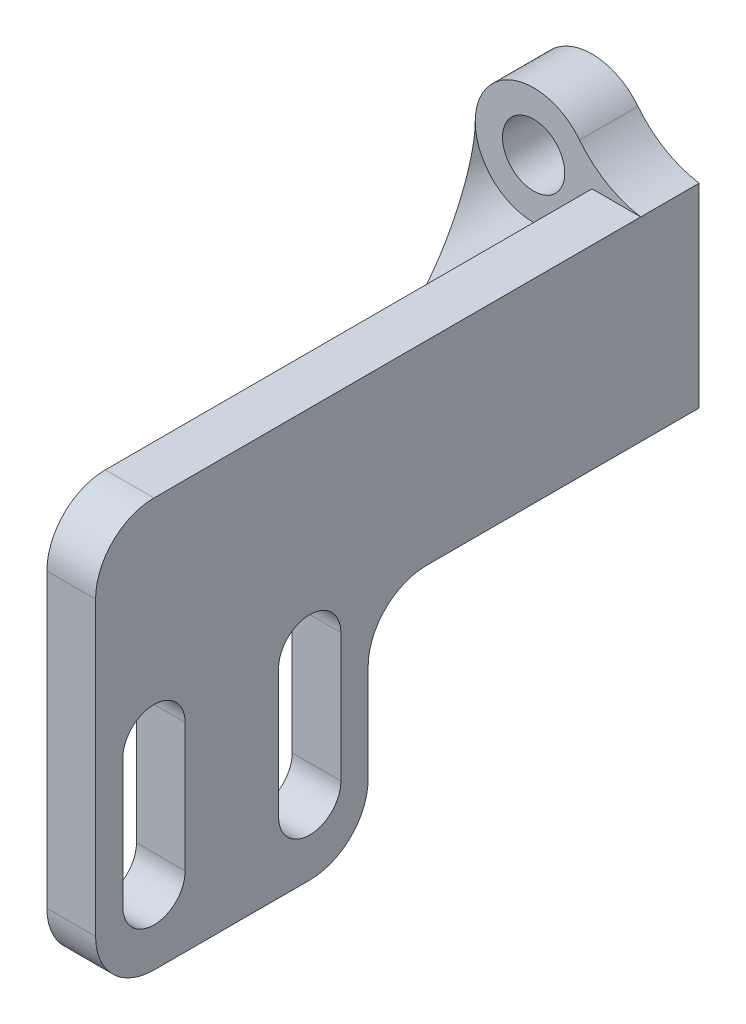
ISO-10303-21;
HEADER;
FILE_DESCRIPTION(('STEP AP214'),'2;1');
FILE_NAME('part.step','',(''),(''),'','','');
FILE_SCHEMA(('AUTOMOTIVE_DESIGN { 1 0 10303 214 1 1 1 1 }'));
ENDSEC;
DATA;
#1=APPLICATION_CONTEXT('core data for automotive mechanical design processes');
#2=APPLICATION_PROTOCOL_DEFINITION('international standard','automotive_design',2000,#1);
#3=PRODUCT_CONTEXT('',#1,'mechanical');
#4=PRODUCT('Part','Part','',(#3));
#5=PRODUCT_RELATED_PRODUCT_CATEGORY('part','',(#4));
#6=PRODUCT_DEFINITION_FORMATION('','',#4);
#7=PRODUCT_DEFINITION_CONTEXT('part definition',#1,'design');
#8=PRODUCT_DEFINITION('design','',#6,#7);
#9=PRODUCT_DEFINITION_SHAPE('','',#8);
#10=(LENGTH_UNIT() NAMED_UNIT(*) SI_UNIT(.MILLI.,.METRE.));
#11=(NAMED_UNIT(*) PLANE_ANGLE_UNIT() SI_UNIT($,.RADIAN.));
#12=(NAMED_UNIT(*) SI_UNIT($,.STERADIAN.) SOLID_ANGLE_UNIT());
#13=UNCERTAINTY_MEASURE_WITH_UNIT(LENGTH_MEASURE(1.E-05),#10,'distance_accuracy_value','');
#14=(GEOMETRIC_REPRESENTATION_CONTEXT(3) GLOBAL_UNCERTAINTY_ASSIGNED_CONTEXT((#13)) GLOBAL_UNIT_ASSIGNED_CONTEXT((#10,
#11,#12)) REPRESENTATION_CONTEXT('',''));
#15=CARTESIAN_POINT('',(0.,0.,0.));
#16=DIRECTION('',(0.,0.,1.));
#17=DIRECTION('',(1.,0.,0.));
#18=AXIS2_PLACEMENT_3D('',#15,#16,#17);
#19=CARTESIAN_POINT('',(3.00000000000005,-33.0103407456897,3.));
#20=DIRECTION('',(0.,1.,0.));
#21=DIRECTION('',(0.,0.,1.));
#22=AXIS2_PLACEMENT_3D('',#19,#20,#21);
#23=PLANE('',#22);
#24=DIRECTION('',(0.,0.,-1.));
#25=VECTOR('',#24,1.);
#26=CARTESIAN_POINT('',(3.00000000000005,-33.0103407456897,31.));
#27=LINE('',#26,#25);
#28=CARTESIAN_POINT('',(3.00000000000005,-33.0103407456897,28.));
#29=VERTEX_POINT('',#28);
#30=CARTESIAN_POINT('',(3.00000000000004,-33.0103407456897,14.));
#31=VERTEX_POINT('',#30);
#32=EDGE_CURVE('E368',#29,#31,#27,.T.);
#33=ORIENTED_EDGE('',*,*,#32,.F.);
#34=DIRECTION('',(-1.,0.,0.));
#35=VECTOR('',#34,1.);
#36=CARTESIAN_POINT('',(3.00000000000005,-33.0103407456897,28.));
#37=LINE('',#36,#35);
#38=CARTESIAN_POINT('',(5.50000000000005,-33.0103407456897,28.));
#39=VERTEX_POINT('',#38);
#40=EDGE_CURVE('E316',#29,#39,#37,.F.);
#41=ORIENTED_EDGE('',*,*,#40,.T.);
#42=DIRECTION('',(0.,0.,-1.));
#43=VECTOR('',#42,1.);
#44=CARTESIAN_POINT('',(5.50000000000005,-33.0103407456897,3.));
#45=LINE('',#44,#43);
#46=CARTESIAN_POINT('',(5.50000000000005,-33.0103407456897,3.));
#47=VERTEX_POINT('',#46);
#48=EDGE_CURVE('E260',#39,#47,#45,.T.);
#49=ORIENTED_EDGE('',*,*,#48,.T.);
#50=DIRECTION('',(-1.,0.,0.));
#51=VECTOR('',#50,1.);
#52=CARTESIAN_POINT('',(0.,-33.0103407456897,3.));
#53=LINE('',#52,#51);
#54=CARTESIAN_POINT('',(3.00000000000004,-33.0103407456897,3.));
#55=VERTEX_POINT('',#54);
#56=EDGE_CURVE('E253',#47,#55,#53,.T.);
#57=ORIENTED_EDGE('',*,*,#56,.T.);
#58=DIRECTION('',(0.,0.,-1.));
#59=VECTOR('',#58,1.);
#60=CARTESIAN_POINT('',(3.00000000000004,-33.0103407456897,31.));
#61=LINE('',#60,#59);
#62=EDGE_CURVE('E236',#55,#31,#61,.F.);
#63=ORIENTED_EDGE('',*,*,#62,.T.);
#64=EDGE_LOOP('',(#33,#41,#49,#57,#63));
#65=FACE_BOUND('',#64,.T.);
#66=ADVANCED_FACE('F67',(#65),#23,.T.);
#67=CARTESIAN_POINT('',(5.50000000000005,-43.0103407456897,3.));
#68=DIRECTION('',(0.,-1.,0.));
#69=DIRECTION('',(0.,0.,-1.));
#70=AXIS2_PLACEMENT_3D('',#67,#68,#69);
#71=PLANE('',#70);
#72=DIRECTION('',(0.,0.,-1.));
#73=VECTOR('',#72,1.);
#74=CARTESIAN_POINT('',(5.50000000000005,-43.0103407456897,3.));
#75=LINE('',#74,#73);
#76=CARTESIAN_POINT('',(5.50000000000005,-43.0103407456897,14.));
#77=VERTEX_POINT('',#76);
#78=CARTESIAN_POINT('',(5.50000000000005,-43.0103407456897,3.));
#79=VERTEX_POINT('',#78);
#80=EDGE_CURVE('E323',#77,#79,#75,.T.);
#81=ORIENTED_EDGE('',*,*,#80,.F.);
#82=DIRECTION('',(1.,0.,0.));
#83=VECTOR('',#82,1.);
#84=CARTESIAN_POINT('',(3.00000000000005,-43.0103407456897,14.));
#85=LINE('',#84,#83);
#86=CARTESIAN_POINT('',(3.00000000000005,-43.0103407456897,14.));
#87=VERTEX_POINT('',#86);
#88=EDGE_CURVE('E293',#77,#87,#85,.F.);
#89=ORIENTED_EDGE('',*,*,#88,.T.);
#90=DIRECTION('',(0.,0.,-1.));
#91=VECTOR('',#90,1.);
#92=CARTESIAN_POINT('',(3.00000000000005,-43.0103407456897,31.));
#93=LINE('',#92,#91);
#94=CARTESIAN_POINT('',(3.00000000000005,-43.0103407456897,3.));
#95=VERTEX_POINT('',#94);
#96=EDGE_CURVE('E245',#87,#95,#93,.T.);
#97=ORIENTED_EDGE('',*,*,#96,.T.);
#98=DIRECTION('',(1.,0.,0.));
#99=VECTOR('',#98,1.);
#100=CARTESIAN_POINT('',(0.,-43.0103407456897,3.));
#101=LINE('',#100,#99);
#102=EDGE_CURVE('E335',#95,#79,#101,.T.);
#103=ORIENTED_EDGE('',*,*,#102,.T.);
#104=EDGE_LOOP('',(#81,#89,#97,#103));
#105=FACE_BOUND('',#104,.T.);
#106=ADVANCED_FACE('F331',(#105),#71,.T.);
#107=CARTESIAN_POINT('',(3.00000000000005,-20.480376659548,14.));
#108=DIRECTION('',(-0.877895572914384,0.,0.478852130680573));
#109=DIRECTION('',(0.478852130680573,0.,0.877895572914384));
#110=AXIS2_PLACEMENT_3D('',#107,#108,#109);
#111=PLANE('',#110);
#112=DIRECTION('',(0.,-1.,0.));
#113=VECTOR('',#112,1.);
#114=CARTESIAN_POINT('',(-2.99999999999995,0.,3.));
#115=LINE('',#114,#113);
#116=CARTESIAN_POINT('',(-2.99999999999995,-33.0103407456897,3.));
#117=VERTEX_POINT('',#116);
#118=CARTESIAN_POINT('',(-2.99999999999995,-43.0103407456897,3.));
#119=VERTEX_POINT('',#118);
#120=EDGE_CURVE('E371',#117,#119,#115,.T.);
#121=ORIENTED_EDGE('',*,*,#120,.T.);
#122=CARTESIAN_POINT('',(0.,-43.0103407456897,8.5));
#123=DIRECTION('',(-0.877895572914384,0.,0.478852130680573));
#124=DIRECTION('',(-0.478852130680573,0.,-0.877895572914384));
#125=AXIS2_PLACEMENT_3D('',#122,#123,#124);
#126=ELLIPSE('',#125,6.26498204307084,3.);
#127=EDGE_CURVE('E290',#119,#87,#126,.F.);
#128=ORIENTED_EDGE('',*,*,#127,.T.);
#129=DIRECTION('',(0.,-1.,0.));
#130=VECTOR('',#129,1.);
#131=CARTESIAN_POINT('',(3.00000000000005,-20.480376659548,14.));
#132=LINE('',#131,#130);
#133=EDGE_CURVE('E348',#31,#87,#132,.T.);
#134=ORIENTED_EDGE('',*,*,#133,.F.);
#135=CARTESIAN_POINT('',(0.,-33.0103407456897,8.5));
#136=DIRECTION('',(-0.877895572914384,0.,0.478852130680573));
#137=DIRECTION('',(-0.478852130680573,0.,-0.877895572914384));
#138=AXIS2_PLACEMENT_3D('',#135,#136,#137);
#139=ELLIPSE('',#138,6.26498204307082,2.99999999999999);
#140=EDGE_CURVE('E241',#31,#117,#139,.F.);
#141=ORIENTED_EDGE('',*,*,#140,.T.);
#142=EDGE_LOOP('',(#121,#128,#134,#141));
#143=FACE_BOUND('',#142,.T.);
#144=ADVANCED_FACE('F440',(#143),#111,.T.);
#145=CARTESIAN_POINT('',(0.,0.,3.));
#146=DIRECTION('',(0.,0.,1.));
#147=DIRECTION('',(1.,0.,0.));
#148=AXIS2_PLACEMENT_3D('',#145,#146,#147);
#149=PLANE('',#148);
#150=CARTESIAN_POINT('',(0.,-43.0103407456897,3.));
#151=DIRECTION('',(0.,0.,1.));
#152=DIRECTION('',(1.,0.,0.));
#153=AXIS2_PLACEMENT_3D('',#150,#151,#152);
#154=CIRCLE('',#153,3.);
#155=CARTESIAN_POINT('',(2.3607954545455,-44.8614606288408,3.));
#156=VERTEX_POINT('',#155);
#157=EDGE_CURVE('E374',#119,#156,#154,.T.);
#158=ORIENTED_EDGE('',*,*,#157,.T.);
#159=CARTESIAN_POINT('',(6.29545454545459,-47.9466604340928,3.));
#160=DIRECTION('',(0.,0.,1.));
#161=DIRECTION('',(1.,0.,0.));
#162=AXIS2_PLACEMENT_3D('',#159,#160,#161);
#163=CIRCLE('',#162,5.);
#164=EDGE_CURVE('E267',#156,#79,#163,.F.);
#165=ORIENTED_EDGE('',*,*,#164,.T.);
#166=ORIENTED_EDGE('',*,*,#102,.F.);
#167=CARTESIAN_POINT('',(0.,-43.0103407456897,3.));
#168=DIRECTION('',(0.,0.,1.));
#169=DIRECTION('',(1.,0.,0.));
#170=AXIS2_PLACEMENT_3D('',#167,#168,#169);
#171=CIRCLE('',#170,3.);
#172=EDGE_CURVE('E246',#95,#119,#171,.T.);
#173=ORIENTED_EDGE('',*,*,#172,.T.);
#174=EDGE_LOOP('',(#158,#165,#166,#173));
#175=FACE_BOUND('',#174,.T.);
#176=CARTESIAN_POINT('',(0.,-43.0103407456897,3.));
#177=DIRECTION('',(0.,0.,1.));
#178=DIRECTION('',(1.,0.,0.));
#179=AXIS2_PLACEMENT_3D('',#176,#177,#178);
#180=CIRCLE('',#179,1.6);
#181=CARTESIAN_POINT('',(1.60000000000005,-43.0103407456897,3.));
#182=VERTEX_POINT('',#181);
#183=EDGE_CURVE('E382',#182,#182,#180,.T.);
#184=ORIENTED_EDGE('',*,*,#183,.F.);
#185=EDGE_LOOP('',(#184));
#186=FACE_BOUND('',#185,.T.);
#187=ADVANCED_FACE('F414',(#175,#186),#149,.T.);
#188=CARTESIAN_POINT('',(0.,-43.0103407456897,3.));
#189=DIRECTION('',(0.,0.,-1.));
#190=DIRECTION('',(-1.,0.,0.));
#191=AXIS2_PLACEMENT_3D('',#188,#189,#190);
#192=CYLINDRICAL_SURFACE('',#191,1.6);
#193=ORIENTED_EDGE('',*,*,#183,.T.);
#194=EDGE_LOOP('',(#193));
#195=FACE_BOUND('',#194,.T.);
#196=CARTESIAN_POINT('',(0.,-43.0103407456897,0.));
#197=DIRECTION('',(0.,0.,1.));
#198=DIRECTION('',(1.,0.,0.));
#199=AXIS2_PLACEMENT_3D('',#196,#197,#198);
#200=CIRCLE('',#199,1.6);
#201=CARTESIAN_POINT('',(1.60000000000005,-43.0103407456897,0.));
#202=VERTEX_POINT('',#201);
#203=EDGE_CURVE('E375',#202,#202,#200,.T.);
#204=ORIENTED_EDGE('',*,*,#203,.F.);
#205=EDGE_LOOP('',(#204));
#206=FACE_BOUND('',#205,.T.);
#207=ADVANCED_FACE('F451',(#195,#206),#192,.F.);
#208=CARTESIAN_POINT('',(0.,-33.0103407456897,3.));
#209=DIRECTION('',(0.,0.,-1.));
#210=DIRECTION('',(-1.,0.,0.));
#211=AXIS2_PLACEMENT_3D('',#208,#209,#210);
#212=CYLINDRICAL_SURFACE('',#211,1.6);
#213=CARTESIAN_POINT('',(0.,-33.0103407456897,3.));
#214=DIRECTION('',(0.,0.,1.));
#215=DIRECTION('',(1.,0.,0.));
#216=AXIS2_PLACEMENT_3D('',#213,#214,#215);
#217=CIRCLE('',#216,1.6);
#218=CARTESIAN_POINT('',(1.60000000000005,-33.0103407456897,3.));
#219=VERTEX_POINT('',#218);
#220=EDGE_CURVE('E379',#219,#219,#217,.T.);
#221=ORIENTED_EDGE('',*,*,#220,.T.);
#222=EDGE_LOOP('',(#221));
#223=FACE_BOUND('',#222,.T.);
#224=CARTESIAN_POINT('',(0.,-33.0103407456897,0.));
#225=DIRECTION('',(0.,0.,1.));
#226=DIRECTION('',(1.,0.,0.));
#227=AXIS2_PLACEMENT_3D('',#224,#225,#226);
#228=CIRCLE('',#227,1.6);
#229=CARTESIAN_POINT('',(1.60000000000005,-33.0103407456897,0.));
#230=VERTEX_POINT('',#229);
#231=EDGE_CURVE('E394',#230,#230,#228,.T.);
#232=ORIENTED_EDGE('',*,*,#231,.F.);
#233=EDGE_LOOP('',(#232));
#234=FACE_BOUND('',#233,.T.);
#235=ADVANCED_FACE('F444',(#223,#234),#212,.F.);
#236=CARTESIAN_POINT('',(0.,-43.0103407456897,3.));
#237=DIRECTION('',(0.,0.,-1.));
#238=DIRECTION('',(-1.,0.,0.));
#239=AXIS2_PLACEMENT_3D('',#236,#237,#238);
#240=CYLINDRICAL_SURFACE('',#239,3.);
#241=CARTESIAN_POINT('',(0.,-43.0103407456897,0.));
#242=DIRECTION('',(0.,0.,1.));
#243=DIRECTION('',(1.,0.,0.));
#244=AXIS2_PLACEMENT_3D('',#241,#242,#243);
#245=CIRCLE('',#244,3.);
#246=CARTESIAN_POINT('',(-2.99999999999995,-43.0103407456897,0.));
#247=VERTEX_POINT('',#246);
#248=CARTESIAN_POINT('',(2.3607954545455,-44.8614606288408,0.));
#249=VERTEX_POINT('',#248);
#250=EDGE_CURVE('E389',#247,#249,#245,.T.);
#251=ORIENTED_EDGE('',*,*,#250,.T.);
#252=DIRECTION('',(0.,0.,-1.));
#253=VECTOR('',#252,1.);
#254=CARTESIAN_POINT('',(2.3607954545455,-44.8614606288408,3.));
#255=LINE('',#254,#253);
#256=EDGE_CURVE('E408',#249,#156,#255,.F.);
#257=ORIENTED_EDGE('',*,*,#256,.T.);
#258=ORIENTED_EDGE('',*,*,#157,.F.);
#259=DIRECTION('',(0.,0.,-1.));
#260=VECTOR('',#259,1.);
#261=CARTESIAN_POINT('',(-2.99999999999995,-43.0103407456897,3.));
#262=LINE('',#261,#260);
#263=EDGE_CURVE('E401',#119,#247,#262,.T.);
#264=ORIENTED_EDGE('',*,*,#263,.T.);
#265=EDGE_LOOP('',(#251,#257,#258,#264));
#266=FACE_BOUND('',#265,.T.);
#267=ADVANCED_FACE('F442',(#266),#240,.T.);
#268=CARTESIAN_POINT('',(0.,-33.0103407456897,3.));
#269=DIRECTION('',(0.,0.,-1.));
#270=DIRECTION('',(-1.,0.,0.));
#271=AXIS2_PLACEMENT_3D('',#268,#269,#270);
#272=CYLINDRICAL_SURFACE('',#271,3.);
#273=CARTESIAN_POINT('',(0.,-33.0103407456897,3.));
#274=DIRECTION('',(0.,0.,1.));
#275=DIRECTION('',(1.,0.,0.));
#276=AXIS2_PLACEMENT_3D('',#273,#274,#275);
#277=CIRCLE('',#276,3.);
#278=CARTESIAN_POINT('',(2.3607954545455,-31.1592208625386,3.));
#279=VERTEX_POINT('',#278);
#280=EDGE_CURVE('E256',#279,#117,#277,.T.);
#281=ORIENTED_EDGE('',*,*,#280,.F.);
#282=DIRECTION('',(0.,0.,-1.));
#283=VECTOR('',#282,1.);
#284=CARTESIAN_POINT('',(2.3607954545455,-31.1592208625386,3.));
#285=LINE('',#284,#283);
#286=CARTESIAN_POINT('',(2.3607954545455,-31.1592208625386,0.));
#287=VERTEX_POINT('',#286);
#288=EDGE_CURVE('E262',#279,#287,#285,.T.);
#289=ORIENTED_EDGE('',*,*,#288,.T.);
#290=CARTESIAN_POINT('',(0.,-33.0103407456897,0.));
#291=DIRECTION('',(0.,0.,1.));
#292=DIRECTION('',(1.,0.,0.));
#293=AXIS2_PLACEMENT_3D('',#290,#291,#292);
#294=CIRCLE('',#293,3.);
#295=CARTESIAN_POINT('',(-2.99999999999995,-33.0103407456897,0.));
#296=VERTEX_POINT('',#295);
#297=EDGE_CURVE('E392',#287,#296,#294,.T.);
#298=ORIENTED_EDGE('',*,*,#297,.T.);
#299=DIRECTION('',(0.,0.,-1.));
#300=VECTOR('',#299,1.);
#301=CARTESIAN_POINT('',(-2.99999999999995,-33.0103407456897,3.));
#302=LINE('',#301,#300);
#303=EDGE_CURVE('E385',#117,#296,#302,.T.);
#304=ORIENTED_EDGE('',*,*,#303,.F.);
#305=EDGE_LOOP('',(#281,#289,#298,#304));
#306=FACE_BOUND('',#305,.T.);
#307=ADVANCED_FACE('F433',(#306),#272,.T.);
#308=CARTESIAN_POINT('',(-2.99999999999995,0.,3.));
#309=DIRECTION('',(1.,0.,0.));
#310=DIRECTION('',(0.,0.,-1.));
#311=AXIS2_PLACEMENT_3D('',#308,#309,#310);
#312=PLANE('',#311);
#313=DIRECTION('',(0.,-1.,0.));
#314=VECTOR('',#313,1.);
#315=CARTESIAN_POINT('',(-2.99999999999995,0.,0.));
#316=LINE('',#315,#314);
#317=EDGE_CURVE('E386',#296,#247,#316,.T.);
#318=ORIENTED_EDGE('',*,*,#317,.T.);
#319=ORIENTED_EDGE('',*,*,#263,.F.);
#320=ORIENTED_EDGE('',*,*,#120,.F.);
#321=ORIENTED_EDGE('',*,*,#303,.T.);
#322=EDGE_LOOP('',(#318,#319,#320,#321));
#323=FACE_BOUND('',#322,.T.);
#324=ADVANCED_FACE('F437',(#323),#312,.F.);
#325=CARTESIAN_POINT('',(0.,0.,0.));
#326=DIRECTION('',(0.,0.,1.));
#327=DIRECTION('',(1.,0.,0.));
#328=AXIS2_PLACEMENT_3D('',#325,#326,#327);
#329=PLANE('',#328);
#330=ORIENTED_EDGE('',*,*,#317,.F.);
#331=ORIENTED_EDGE('',*,*,#297,.F.);
#332=CARTESIAN_POINT('',(6.29545454545459,-28.0740210572866,0.));
#333=DIRECTION('',(0.,0.,1.));
#334=DIRECTION('',(1.,0.,0.));
#335=AXIS2_PLACEMENT_3D('',#332,#333,#334);
#336=CIRCLE('',#335,5.);
#337=CARTESIAN_POINT('',(5.50000000000005,-33.0103407456897,0.));
#338=VERTEX_POINT('',#337);
#339=EDGE_CURVE('E261',#287,#338,#336,.T.);
#340=ORIENTED_EDGE('',*,*,#339,.T.);
#341=DIRECTION('',(0.,-1.,0.));
#342=VECTOR('',#341,1.);
#343=CARTESIAN_POINT('',(5.50000000000005,-33.0103407456897,0.));
#344=LINE('',#343,#342);
#345=CARTESIAN_POINT('',(5.50000000000005,-43.0103407456897,0.));
#346=VERTEX_POINT('',#345);
#347=EDGE_CURVE('E370',#338,#346,#344,.T.);
#348=ORIENTED_EDGE('',*,*,#347,.T.);
#349=CARTESIAN_POINT('',(6.29545454545459,-47.9466604340928,0.));
#350=DIRECTION('',(0.,0.,1.));
#351=DIRECTION('',(1.,0.,0.));
#352=AXIS2_PLACEMENT_3D('',#349,#350,#351);
#353=CIRCLE('',#352,5.);
#354=EDGE_CURVE('E410',#346,#249,#353,.T.);
#355=ORIENTED_EDGE('',*,*,#354,.T.);
#356=ORIENTED_EDGE('',*,*,#250,.F.);
#357=EDGE_LOOP('',(#330,#331,#340,#348,#355,#356));
#358=FACE_BOUND('',#357,.T.);
#359=ORIENTED_EDGE('',*,*,#231,.T.);
#360=EDGE_LOOP('',(#359));
#361=FACE_BOUND('',#360,.T.);
#362=ORIENTED_EDGE('',*,*,#203,.T.);
#363=EDGE_LOOP('',(#362));
#364=FACE_BOUND('',#363,.T.);
#365=ADVANCED_FACE('F425',(#358,#361,#364),#329,.F.);
#366=CARTESIAN_POINT('',(6.29545454545459,-28.0740210572866,3.));
#367=DIRECTION('',(0.,0.,1.));
#368=DIRECTION('',(1.,0.,0.));
#369=AXIS2_PLACEMENT_3D('',#366,#367,#368);
#370=CIRCLE('',#369,5.);
#371=EDGE_CURVE('E264',#47,#279,#370,.F.);
#372=ORIENTED_EDGE('',*,*,#371,.T.);
#373=ORIENTED_EDGE('',*,*,#280,.T.);
#374=CARTESIAN_POINT('',(0.,-33.0103407456897,3.));
#375=DIRECTION('',(0.,0.,1.));
#376=DIRECTION('',(1.,0.,0.));
#377=AXIS2_PLACEMENT_3D('',#374,#375,#376);
#378=CIRCLE('',#377,2.99999999999999);
#379=EDGE_CURVE('E239',#117,#55,#378,.T.);
#380=ORIENTED_EDGE('',*,*,#379,.T.);
#381=ORIENTED_EDGE('',*,*,#56,.F.);
#382=EDGE_LOOP('',(#372,#373,#380,#381));
#383=FACE_BOUND('',#382,.T.);
#384=ORIENTED_EDGE('',*,*,#220,.F.);
#385=EDGE_LOOP('',(#384));
#386=FACE_BOUND('',#385,.T.);
#387=ADVANCED_FACE('F251',(#383,#386),#149,.T.);
#388=CARTESIAN_POINT('',(5.50000000000005,-33.0103407456897,3.));
#389=DIRECTION('',(1.,0.,0.));
#390=DIRECTION('',(0.,0.,-1.));
#391=AXIS2_PLACEMENT_3D('',#388,#389,#390);
#392=PLANE('',#391);
#393=CARTESIAN_POINT('',(5.50000000000005,-50.4027629683853,28.));
#394=DIRECTION('',(1.,0.,0.));
#395=DIRECTION('',(0.,0.,1.));
#396=AXIS2_PLACEMENT_3D('',#393,#394,#395);
#397=CIRCLE('',#396,1.6);
#398=CARTESIAN_POINT('',(5.50000000000005,-50.4027629683853,29.6));
#399=VERTEX_POINT('',#398);
#400=CARTESIAN_POINT('',(5.50000000000005,-50.4027629683853,26.4));
#401=VERTEX_POINT('',#400);
#402=EDGE_CURVE('E582',#399,#401,#397,.T.);
#403=ORIENTED_EDGE('',*,*,#402,.F.);
#404=DIRECTION('',(0.,-1.,0.));
#405=VECTOR('',#404,1.);
#406=CARTESIAN_POINT('',(5.50000000000005,-50.4027629683853,29.6));
#407=LINE('',#406,#405);
#408=CARTESIAN_POINT('',(5.50000000000005,-43.7974390871688,29.6));
#409=VERTEX_POINT('',#408);
#410=EDGE_CURVE('E598',#409,#399,#407,.T.);
#411=ORIENTED_EDGE('',*,*,#410,.F.);
#412=CARTESIAN_POINT('',(5.50000000000005,-43.7974390871688,28.));
#413=DIRECTION('',(1.,0.,0.));
#414=DIRECTION('',(0.,0.,1.));
#415=AXIS2_PLACEMENT_3D('',#412,#413,#414);
#416=CIRCLE('',#415,1.59999999999999);
#417=CARTESIAN_POINT('',(5.50000000000005,-43.7974390871688,26.4));
#418=VERTEX_POINT('',#417);
#419=EDGE_CURVE('E591',#418,#409,#416,.T.);
#420=ORIENTED_EDGE('',*,*,#419,.F.);
#421=DIRECTION('',(0.,1.,0.));
#422=VECTOR('',#421,1.);
#423=CARTESIAN_POINT('',(5.50000000000005,-50.4027629683853,26.4));
#424=LINE('',#423,#422);
#425=EDGE_CURVE('E584',#401,#418,#424,.T.);
#426=ORIENTED_EDGE('',*,*,#425,.F.);
#427=EDGE_LOOP('',(#403,#411,#420,#426));
#428=FACE_BOUND('',#427,.T.);
#429=CARTESIAN_POINT('',(5.50000000000005,-50.4027629683853,20.));
#430=DIRECTION('',(1.,0.,0.));
#431=DIRECTION('',(0.,0.,-1.));
#432=AXIS2_PLACEMENT_3D('',#429,#430,#431);
#433=CIRCLE('',#432,1.6);
#434=CARTESIAN_POINT('',(5.50000000000005,-50.4027629683853,21.6));
#435=VERTEX_POINT('',#434);
#436=CARTESIAN_POINT('',(5.50000000000005,-50.4027629683853,18.4));
#437=VERTEX_POINT('',#436);
#438=EDGE_CURVE('E360',#435,#437,#433,.T.);
#439=ORIENTED_EDGE('',*,*,#438,.F.);
#440=DIRECTION('',(0.,-1.,0.));
#441=VECTOR('',#440,1.);
#442=CARTESIAN_POINT('',(5.50000000000005,-50.4027629683853,21.6));
#443=LINE('',#442,#441);
#444=CARTESIAN_POINT('',(5.50000000000005,-43.7974390871688,21.6));
#445=VERTEX_POINT('',#444);
#446=EDGE_CURVE('E563',#445,#435,#443,.T.);
#447=ORIENTED_EDGE('',*,*,#446,.F.);
#448=CARTESIAN_POINT('',(5.50000000000005,-43.7974390871688,20.));
#449=DIRECTION('',(1.,0.,0.));
#450=DIRECTION('',(0.,0.,-1.));
#451=AXIS2_PLACEMENT_3D('',#448,#449,#450);
#452=CIRCLE('',#451,1.59999999999999);
#453=CARTESIAN_POINT('',(5.50000000000005,-43.7974390871688,18.4));
#454=VERTEX_POINT('',#453);
#455=EDGE_CURVE('E570',#454,#445,#452,.T.);
#456=ORIENTED_EDGE('',*,*,#455,.F.);
#457=DIRECTION('',(0.,1.,0.));
#458=VECTOR('',#457,1.);
#459=CARTESIAN_POINT('',(5.50000000000005,-50.4027629683853,18.4));
#460=LINE('',#459,#458);
#461=EDGE_CURVE('E574',#437,#454,#460,.T.);
#462=ORIENTED_EDGE('',*,*,#461,.F.);
#463=EDGE_LOOP('',(#439,#447,#456,#462));
#464=FACE_BOUND('',#463,.T.);
#465=DIRECTION('',(0.,0.,-1.));
#466=VECTOR('',#465,1.);
#467=CARTESIAN_POINT('',(5.50000000000005,-54.0103407456897,31.));
#468=LINE('',#467,#466);
#469=CARTESIAN_POINT('',(5.50000000000005,-54.0103407456897,28.));
#470=VERTEX_POINT('',#469);
#471=CARTESIAN_POINT('',(5.50000000000005,-54.0103407456897,20.));
#472=VERTEX_POINT('',#471);
#473=EDGE_CURVE('E356',#470,#472,#468,.T.);
#474=ORIENTED_EDGE('',*,*,#473,.T.);
#475=CARTESIAN_POINT('',(5.50000000000005,-51.0103407456897,20.));
#476=DIRECTION('',(1.,0.,0.));
#477=DIRECTION('',(0.,0.,-1.));
#478=AXIS2_PLACEMENT_3D('',#475,#476,#477);
#479=CIRCLE('',#478,3.);
#480=CARTESIAN_POINT('',(5.50000000000005,-51.0103407456897,17.));
#481=VERTEX_POINT('',#480);
#482=EDGE_CURVE('E304',#472,#481,#479,.T.);
#483=ORIENTED_EDGE('',*,*,#482,.T.);
#484=DIRECTION('',(0.,1.,0.));
#485=VECTOR('',#484,1.);
#486=CARTESIAN_POINT('',(5.50000000000005,-54.0103407456897,17.));
#487=LINE('',#486,#485);
#488=CARTESIAN_POINT('',(5.50000000000005,-46.0103407456897,17.));
#489=VERTEX_POINT('',#488);
#490=EDGE_CURVE('E326',#481,#489,#487,.T.);
#491=ORIENTED_EDGE('',*,*,#490,.T.);
#492=CARTESIAN_POINT('',(5.50000000000005,-46.0103407456897,14.));
#493=DIRECTION('',(1.,0.,0.));
#494=DIRECTION('',(0.,0.,-1.));
#495=AXIS2_PLACEMENT_3D('',#492,#493,#494);
#496=CIRCLE('',#495,3.);
#497=EDGE_CURVE('E75',#489,#77,#496,.F.);
#498=ORIENTED_EDGE('',*,*,#497,.T.);
#499=ORIENTED_EDGE('',*,*,#80,.T.);
#500=EDGE_CURVE('E338',#79,#346,#75,.T.);
#501=ORIENTED_EDGE('',*,*,#500,.T.);
#502=ORIENTED_EDGE('',*,*,#347,.F.);
#503=EDGE_CURVE('E337',#47,#338,#45,.T.);
#504=ORIENTED_EDGE('',*,*,#503,.F.);
#505=ORIENTED_EDGE('',*,*,#48,.F.);
#506=CARTESIAN_POINT('',(5.50000000000005,-36.0103407456897,28.));
#507=DIRECTION('',(1.,0.,0.));
#508=DIRECTION('',(0.,0.,-1.));
#509=AXIS2_PLACEMENT_3D('',#506,#507,#508);
#510=CIRCLE('',#509,3.);
#511=CARTESIAN_POINT('',(5.50000000000005,-36.0103407456897,31.));
#512=VERTEX_POINT('',#511);
#513=EDGE_CURVE('E300',#39,#512,#510,.T.);
#514=ORIENTED_EDGE('',*,*,#513,.T.);
#515=DIRECTION('',(0.,1.,0.));
#516=VECTOR('',#515,1.);
#517=CARTESIAN_POINT('',(5.50000000000005,-43.0103407456897,31.));
#518=LINE('',#517,#516);
#519=CARTESIAN_POINT('',(5.50000000000005,-51.0103407456897,31.));
#520=VERTEX_POINT('',#519);
#521=EDGE_CURVE('E365',#520,#512,#518,.T.);
#522=ORIENTED_EDGE('',*,*,#521,.F.);
#523=CARTESIAN_POINT('',(5.50000000000005,-51.0103407456897,28.));
#524=DIRECTION('',(1.,0.,0.));
#525=DIRECTION('',(0.,0.,-1.));
#526=AXIS2_PLACEMENT_3D('',#523,#524,#525);
#527=CIRCLE('',#526,3.);
#528=EDGE_CURVE('E302',#520,#470,#527,.T.);
#529=ORIENTED_EDGE('',*,*,#528,.T.);
#530=EDGE_LOOP('',(#474,#483,#491,#498,#499,#501,#502,#504,#505,#514,#522,#529));
#531=FACE_BOUND('',#530,.T.);
#532=ADVANCED_FACE('F321',(#428,#464,#531),#392,.T.);
#533=CARTESIAN_POINT('',(3.00000000000005,-33.0103407456897,31.));
#534=DIRECTION('',(1.,0.,0.));
#535=DIRECTION('',(0.,0.,-1.));
#536=AXIS2_PLACEMENT_3D('',#533,#534,#535);
#537=PLANE('',#536);
#538=CARTESIAN_POINT('',(3.00000000000005,-43.7974390871688,20.));
#539=DIRECTION('',(1.,0.,0.));
#540=DIRECTION('',(0.,0.,-1.));
#541=AXIS2_PLACEMENT_3D('',#538,#539,#540);
#542=CIRCLE('',#541,1.59999999999999);
#543=CARTESIAN_POINT('',(3.00000000000005,-43.7974390871688,18.4));
#544=VERTEX_POINT('',#543);
#545=CARTESIAN_POINT('',(3.00000000000005,-43.0103407456897,18.6069902366312));
#546=VERTEX_POINT('',#545);
#547=EDGE_CURVE('E282',#544,#546,#542,.T.);
#548=ORIENTED_EDGE('',*,*,#547,.T.);
#549=CARTESIAN_POINT('',(3.00000000000005,-43.0103407456897,18.6069902366312));
#550=CARTESIAN_POINT('',(3.00000000000005,-42.8255462385766,18.7114054775635));
#551=CARTESIAN_POINT('',(3.00000000000005,-42.6739752234487,18.8607770424912));
#552=CARTESIAN_POINT('',(3.00000000000005,-42.5229886259483,19.009572670288));
#553=CARTESIAN_POINT('',(3.00000000000005,-42.4155278479124,19.1935749713602));
#554=CARTESIAN_POINT('',(3.00000000000005,-42.3086218136222,19.3766273991149));
#555=CARTESIAN_POINT('',(3.00000000000005,-42.2529233082254,19.5823027309225));
#556=CARTESIAN_POINT('',(3.00000000000005,-42.1975123346907,19.7869163069301));
#557=CARTESIAN_POINT('',(3.00000000000005,-42.1974390871688,20.));
#558=CARTESIAN_POINT('',(3.00000000000005,-42.1973662177719,20.2119836931563));
#559=CARTESIAN_POINT('',(3.00000000000005,-42.2529233082254,20.4176972690776));
#560=CARTESIAN_POINT('',(3.00000000000005,-42.3081935968411,20.6223488917693));
#561=CARTESIAN_POINT('',(3.00000000000005,-42.4155278479124,20.8064250286398));
#562=CARTESIAN_POINT('',(3.00000000000005,-42.5223080084066,20.9895509110307));
#563=CARTESIAN_POINT('',(3.00000000000005,-42.6739752234487,21.1392229575088));
#564=CARTESIAN_POINT('',(3.00000000000005,-42.8250589415279,21.288319182874));
#565=CARTESIAN_POINT('',(3.00000000000005,-43.0103407456897,21.3930097633688));
#566=B_SPLINE_CURVE_WITH_KNOTS('',2,(#549,#550,#551,#552,#553,#554,#555,#556,#557,#558,#559,
#560,#561,#562,#563,#564,#565),.UNSPECIFIED.,.F.,.F.,(3,2,2,2,2,2,2,2,3),(0.,0.125,0.25,0.375,
0.5,0.625,0.75,0.875,1.),.UNSPECIFIED.);
#567=CARTESIAN_POINT('',(3.00000000000005,-43.0103407456897,21.3930097633688));
#568=VERTEX_POINT('',#567);
#569=EDGE_CURVE('E286',#546,#568,#566,.T.);
#570=ORIENTED_EDGE('',*,*,#569,.T.);
#571=CARTESIAN_POINT('',(3.00000000000005,-43.7974390871688,21.6));
#572=VERTEX_POINT('',#571);
#573=EDGE_CURVE('E275',#568,#572,#542,.T.);
#574=ORIENTED_EDGE('',*,*,#573,.T.);
#575=DIRECTION('',(0.,-1.,0.));
#576=VECTOR('',#575,1.);
#577=CARTESIAN_POINT('',(3.00000000000005,-33.0103407456897,21.6));
#578=LINE('',#577,#576);
#579=CARTESIAN_POINT('',(3.00000000000005,-50.4027629683853,21.6));
#580=VERTEX_POINT('',#579);
#581=EDGE_CURVE('E278',#572,#580,#578,.T.);
#582=ORIENTED_EDGE('',*,*,#581,.T.);
#583=CARTESIAN_POINT('',(3.00000000000005,-50.4027629683853,20.));
#584=DIRECTION('',(1.,0.,0.));
#585=DIRECTION('',(0.,0.,-1.));
#586=AXIS2_PLACEMENT_3D('',#583,#584,#585);
#587=CIRCLE('',#586,1.6);
#588=CARTESIAN_POINT('',(3.00000000000005,-50.4027629683853,18.4));
#589=VERTEX_POINT('',#588);
#590=EDGE_CURVE('E630',#580,#589,#587,.T.);
#591=ORIENTED_EDGE('',*,*,#590,.T.);
#592=DIRECTION('',(0.,1.,0.));
#593=VECTOR('',#592,1.);
#594=CARTESIAN_POINT('',(3.00000000000005,-33.0103407456897,18.4));
#595=LINE('',#594,#593);
#596=EDGE_CURVE('E272',#589,#544,#595,.T.);
#597=ORIENTED_EDGE('',*,*,#596,.T.);
#598=EDGE_LOOP('',(#548,#570,#574,#582,#591,#597));
#599=FACE_BOUND('',#598,.T.);
#600=CARTESIAN_POINT('',(3.00000000000005,-43.7974390871688,28.));
#601=DIRECTION('',(1.,0.,0.));
#602=DIRECTION('',(0.,0.,-1.));
#603=AXIS2_PLACEMENT_3D('',#600,#601,#602);
#604=CIRCLE('',#603,1.59999999999999);
#605=CARTESIAN_POINT('',(3.00000000000005,-43.7974390871688,26.4));
#606=VERTEX_POINT('',#605);
#607=CARTESIAN_POINT('',(3.00000000000005,-43.0103407456897,26.6069902366312));
#608=VERTEX_POINT('',#607);
#609=EDGE_CURVE('E621',#606,#608,#604,.T.);
#610=ORIENTED_EDGE('',*,*,#609,.T.);
#611=CARTESIAN_POINT('',(3.00000000000005,-43.0103407456897,26.6069902366312));
#612=CARTESIAN_POINT('',(3.00000000000005,-42.8255462385766,26.7114054775635));
#613=CARTESIAN_POINT('',(3.00000000000005,-42.6739752234487,26.8607770424912));
#614=CARTESIAN_POINT('',(3.00000000000005,-42.5229886259493,27.009572670287));
#615=CARTESIAN_POINT('',(3.00000000000005,-42.4155278479124,27.1935749713602));
#616=CARTESIAN_POINT('',(3.00000000000005,-42.3086218136226,27.3766273991136));
#617=CARTESIAN_POINT('',(3.00000000000005,-42.2529233082254,27.5823027309224));
#618=CARTESIAN_POINT('',(3.00000000000005,-42.1975123346907,27.7869163069301));
#619=CARTESIAN_POINT('',(3.00000000000005,-42.1974390871688,28.));
#620=CARTESIAN_POINT('',(3.00000000000005,-42.1973662177719,28.2119836931569));
#621=CARTESIAN_POINT('',(3.00000000000005,-42.2529233082254,28.4176972690775));
#622=CARTESIAN_POINT('',(3.00000000000005,-42.3081935968415,28.6223488917699));
#623=CARTESIAN_POINT('',(3.00000000000005,-42.4155278479124,28.8064250286398));
#624=CARTESIAN_POINT('',(3.00000000000005,-42.5223080084056,28.9895509110291));
#625=CARTESIAN_POINT('',(3.00000000000005,-42.6739752234487,29.1392229575088));
#626=CARTESIAN_POINT('',(3.00000000000005,-42.8250589415263,29.2883191828731));
#627=CARTESIAN_POINT('',(3.00000000000005,-43.0103407456897,29.3930097633688));
#628=B_SPLINE_CURVE_WITH_KNOTS('',2,(#611,#612,#613,#614,#615,#616,#617,#618,#619,#620,#621,
#622,#623,#624,#625,#626,#627),.UNSPECIFIED.,.F.,.F.,(3,2,2,2,2,2,2,2,3),(0.,0.125,0.25,0.375,
0.5,0.625,0.75,0.875,1.),.UNSPECIFIED.);
#629=CARTESIAN_POINT('',(3.00000000000005,-43.0103407456897,29.3930097633688));
#630=VERTEX_POINT('',#629);
#631=EDGE_CURVE('E623',#608,#630,#628,.T.);
#632=ORIENTED_EDGE('',*,*,#631,.T.);
#633=CARTESIAN_POINT('',(3.00000000000005,-43.7974390871688,29.6));
#634=VERTEX_POINT('',#633);
#635=EDGE_CURVE('E629',#630,#634,#604,.T.);
#636=ORIENTED_EDGE('',*,*,#635,.T.);
#637=DIRECTION('',(0.,-1.,0.));
#638=VECTOR('',#637,1.);
#639=CARTESIAN_POINT('',(3.00000000000005,-33.0103407456897,29.6));
#640=LINE('',#639,#638);
#641=CARTESIAN_POINT('',(3.00000000000005,-50.4027629683853,29.6));
#642=VERTEX_POINT('',#641);
#643=EDGE_CURVE('E625',#634,#642,#640,.T.);
#644=ORIENTED_EDGE('',*,*,#643,.T.);
#645=CARTESIAN_POINT('',(3.00000000000005,-50.4027629683853,28.));
#646=DIRECTION('',(1.,0.,0.));
#647=DIRECTION('',(0.,0.,-1.));
#648=AXIS2_PLACEMENT_3D('',#645,#646,#647);
#649=CIRCLE('',#648,1.6);
#650=CARTESIAN_POINT('',(3.00000000000005,-50.4027629683853,26.4));
#651=VERTEX_POINT('',#650);
#652=EDGE_CURVE('E628',#642,#651,#649,.T.);
#653=ORIENTED_EDGE('',*,*,#652,.T.);
#654=DIRECTION('',(0.,1.,0.));
#655=VECTOR('',#654,1.);
#656=CARTESIAN_POINT('',(3.00000000000005,-33.0103407456897,26.4));
#657=LINE('',#656,#655);
#658=EDGE_CURVE('E613',#651,#606,#657,.T.);
#659=ORIENTED_EDGE('',*,*,#658,.T.);
#660=EDGE_LOOP('',(#610,#632,#636,#644,#653,#659));
#661=FACE_BOUND('',#660,.T.);
#662=DIRECTION('',(0.,-1.,0.));
#663=VECTOR('',#662,1.);
#664=CARTESIAN_POINT('',(3.00000000000005,-54.0103407456897,17.));
#665=LINE('',#664,#663);
#666=CARTESIAN_POINT('',(3.00000000000005,-46.0103407456897,17.));
#667=VERTEX_POINT('',#666);
#668=CARTESIAN_POINT('',(3.00000000000005,-51.0103407456897,17.));
#669=VERTEX_POINT('',#668);
#670=EDGE_CURVE('E346',#667,#669,#665,.T.);
#671=ORIENTED_EDGE('',*,*,#670,.T.);
#672=CARTESIAN_POINT('',(3.00000000000005,-51.0103407456897,20.));
#673=DIRECTION('',(1.,0.,0.));
#674=DIRECTION('',(0.,0.,-1.));
#675=AXIS2_PLACEMENT_3D('',#672,#673,#674);
#676=CIRCLE('',#675,3.);
#677=CARTESIAN_POINT('',(3.00000000000005,-54.0103407456897,20.));
#678=VERTEX_POINT('',#677);
#679=EDGE_CURVE('E308',#669,#678,#676,.F.);
#680=ORIENTED_EDGE('',*,*,#679,.T.);
#681=DIRECTION('',(0.,0.,1.));
#682=VECTOR('',#681,1.);
#683=CARTESIAN_POINT('',(3.00000000000005,-54.0103407456897,31.));
#684=LINE('',#683,#682);
#685=CARTESIAN_POINT('',(3.00000000000005,-54.0103407456897,28.));
#686=VERTEX_POINT('',#685);
#687=EDGE_CURVE('E352',#678,#686,#684,.T.);
#688=ORIENTED_EDGE('',*,*,#687,.T.);
#689=CARTESIAN_POINT('',(3.00000000000005,-51.0103407456897,28.));
#690=DIRECTION('',(1.,0.,0.));
#691=DIRECTION('',(0.,0.,-1.));
#692=AXIS2_PLACEMENT_3D('',#689,#690,#691);
#693=CIRCLE('',#692,3.);
#694=CARTESIAN_POINT('',(3.00000000000005,-51.0103407456897,31.));
#695=VERTEX_POINT('',#694);
#696=EDGE_CURVE('E88',#686,#695,#693,.F.);
#697=ORIENTED_EDGE('',*,*,#696,.T.);
#698=DIRECTION('',(0.,-1.,0.));
#699=VECTOR('',#698,1.);
#700=CARTESIAN_POINT('',(3.00000000000005,-33.0103407456897,31.));
#701=LINE('',#700,#699);
#702=CARTESIAN_POINT('',(3.00000000000005,-36.0103407456897,31.));
#703=VERTEX_POINT('',#702);
#704=EDGE_CURVE('E354',#703,#695,#701,.T.);
#705=ORIENTED_EDGE('',*,*,#704,.F.);
#706=CARTESIAN_POINT('',(3.00000000000005,-36.0103407456897,28.));
#707=DIRECTION('',(1.,0.,0.));
#708=DIRECTION('',(0.,0.,-1.));
#709=AXIS2_PLACEMENT_3D('',#706,#707,#708);
#710=CIRCLE('',#709,3.);
#711=EDGE_CURVE('E82',#703,#29,#710,.F.);
#712=ORIENTED_EDGE('',*,*,#711,.T.);
#713=ORIENTED_EDGE('',*,*,#32,.T.);
#714=ORIENTED_EDGE('',*,*,#133,.T.);
#715=CARTESIAN_POINT('',(3.00000000000005,-46.0103407456897,14.));
#716=DIRECTION('',(1.,0.,0.));
#717=DIRECTION('',(0.,0.,-1.));
#718=AXIS2_PLACEMENT_3D('',#715,#716,#717);
#719=CIRCLE('',#718,3.);
#720=EDGE_CURVE('E12',#87,#667,#719,.T.);
#721=ORIENTED_EDGE('',*,*,#720,.T.);
#722=EDGE_LOOP('',(#671,#680,#688,#697,#705,#712,#713,#714,#721));
#723=FACE_BOUND('',#722,.T.);
#724=ADVANCED_FACE('F345',(#599,#661,#723),#537,.F.);
#725=CARTESIAN_POINT('',(0.,0.,31.));
#726=DIRECTION('',(0.,0.,1.));
#727=DIRECTION('',(1.,0.,0.));
#728=AXIS2_PLACEMENT_3D('',#725,#726,#727);
#729=PLANE('',#728);
#730=ORIENTED_EDGE('',*,*,#704,.T.);
#731=DIRECTION('',(1.,0.,0.));
#732=VECTOR('',#731,1.);
#733=CARTESIAN_POINT('',(0.,-51.0103407456897,31.));
#734=LINE('',#733,#732);
#735=EDGE_CURVE('E313',#695,#520,#734,.T.);
#736=ORIENTED_EDGE('',*,*,#735,.T.);
#737=ORIENTED_EDGE('',*,*,#521,.T.);
#738=DIRECTION('',(-1.,0.,0.));
#739=VECTOR('',#738,1.);
#740=CARTESIAN_POINT('',(0.,-36.0103407456897,31.));
#741=LINE('',#740,#739);
#742=EDGE_CURVE('E310',#512,#703,#741,.T.);
#743=ORIENTED_EDGE('',*,*,#742,.T.);
#744=EDGE_LOOP('',(#730,#736,#737,#743));
#745=FACE_BOUND('',#744,.T.);
#746=ADVANCED_FACE('F468',(#745),#729,.T.);
#747=CARTESIAN_POINT('',(6.29545454545459,-47.9466604340928,3.));
#748=DIRECTION('',(0.,0.,1.));
#749=DIRECTION('',(1.,0.,0.));
#750=AXIS2_PLACEMENT_3D('',#747,#748,#749);
#751=CYLINDRICAL_SURFACE('',#750,5.);
#752=ORIENTED_EDGE('',*,*,#164,.F.);
#753=ORIENTED_EDGE('',*,*,#256,.F.);
#754=ORIENTED_EDGE('',*,*,#354,.F.);
#755=ORIENTED_EDGE('',*,*,#500,.F.);
#756=EDGE_LOOP('',(#752,#753,#754,#755));
#757=FACE_BOUND('',#756,.T.);
#758=ADVANCED_FACE('F420',(#757),#751,.F.);
#759=CARTESIAN_POINT('',(6.29545454545459,-28.0740210572866,3.));
#760=DIRECTION('',(0.,0.,1.));
#761=DIRECTION('',(1.,0.,0.));
#762=AXIS2_PLACEMENT_3D('',#759,#760,#761);
#763=CYLINDRICAL_SURFACE('',#762,5.);
#764=ORIENTED_EDGE('',*,*,#371,.F.);
#765=ORIENTED_EDGE('',*,*,#503,.T.);
#766=ORIENTED_EDGE('',*,*,#339,.F.);
#767=ORIENTED_EDGE('',*,*,#288,.F.);
#768=EDGE_LOOP('',(#764,#765,#766,#767));
#769=FACE_BOUND('',#768,.T.);
#770=ADVANCED_FACE('F431',(#769),#763,.F.);
#771=CARTESIAN_POINT('',(-14.8044938147648,-54.0103407456897,17.));
#772=DIRECTION('',(0.,0.,-1.));
#773=DIRECTION('',(-1.,0.,0.));
#774=AXIS2_PLACEMENT_3D('',#771,#772,#773);
#775=PLANE('',#774);
#776=ORIENTED_EDGE('',*,*,#670,.F.);
#777=DIRECTION('',(1.,0.,0.));
#778=VECTOR('',#777,1.);
#779=CARTESIAN_POINT('',(5.50000000000005,-46.0103407456897,17.));
#780=LINE('',#779,#778);
#781=EDGE_CURVE('E289',#667,#489,#780,.T.);
#782=ORIENTED_EDGE('',*,*,#781,.T.);
#783=ORIENTED_EDGE('',*,*,#490,.F.);
#784=DIRECTION('',(1.,0.,0.));
#785=VECTOR('',#784,1.);
#786=CARTESIAN_POINT('',(-14.8044938147648,-51.0103407456897,17.));
#787=LINE('',#786,#785);
#788=EDGE_CURVE('E287',#481,#669,#787,.F.);
#789=ORIENTED_EDGE('',*,*,#788,.T.);
#790=EDGE_LOOP('',(#776,#782,#783,#789));
#791=FACE_BOUND('',#790,.T.);
#792=ADVANCED_FACE('F350',(#791),#775,.T.);
#793=CARTESIAN_POINT('',(-14.8044938147648,-54.0103407456897,31.));
#794=DIRECTION('',(0.,-1.,0.));
#795=DIRECTION('',(0.,0.,-1.));
#796=AXIS2_PLACEMENT_3D('',#793,#794,#795);
#797=PLANE('',#796);
#798=ORIENTED_EDGE('',*,*,#687,.F.);
#799=DIRECTION('',(1.,0.,0.));
#800=VECTOR('',#799,1.);
#801=CARTESIAN_POINT('',(-14.8044938147648,-54.0103407456897,20.));
#802=LINE('',#801,#800);
#803=EDGE_CURVE('E297',#678,#472,#802,.T.);
#804=ORIENTED_EDGE('',*,*,#803,.T.);
#805=ORIENTED_EDGE('',*,*,#473,.F.);
#806=DIRECTION('',(1.,0.,0.));
#807=VECTOR('',#806,1.);
#808=CARTESIAN_POINT('',(-14.8044938147648,-54.0103407456897,28.));
#809=LINE('',#808,#807);
#810=EDGE_CURVE('E295',#470,#686,#809,.F.);
#811=ORIENTED_EDGE('',*,*,#810,.T.);
#812=EDGE_LOOP('',(#798,#804,#805,#811));
#813=FACE_BOUND('',#812,.T.);
#814=ADVANCED_FACE('F494',(#813),#797,.T.);
#815=CARTESIAN_POINT('',(-2.99999999999995,-50.4027629683853,20.));
#816=DIRECTION('',(1.,0.,0.));
#817=DIRECTION('',(0.,0.,-1.));
#818=AXIS2_PLACEMENT_3D('',#815,#816,#817);
#819=CYLINDRICAL_SURFACE('',#818,1.6);
#820=DIRECTION('',(1.,0.,0.));
#821=VECTOR('',#820,1.);
#822=CARTESIAN_POINT('',(-2.99999999999995,-50.4027629683853,21.6));
#823=LINE('',#822,#821);
#824=EDGE_CURVE('E567',#580,#435,#823,.T.);
#825=ORIENTED_EDGE('',*,*,#824,.T.);
#826=ORIENTED_EDGE('',*,*,#438,.T.);
#827=DIRECTION('',(1.,0.,0.));
#828=VECTOR('',#827,1.);
#829=CARTESIAN_POINT('',(-2.99999999999995,-50.4027629683853,18.4));
#830=LINE('',#829,#828);
#831=EDGE_CURVE('E576',#589,#437,#830,.T.);
#832=ORIENTED_EDGE('',*,*,#831,.F.);
#833=ORIENTED_EDGE('',*,*,#590,.F.);
#834=EDGE_LOOP('',(#825,#826,#832,#833));
#835=FACE_BOUND('',#834,.T.);
#836=ADVANCED_FACE('F497',(#835),#819,.F.);
#837=CARTESIAN_POINT('',(-2.99999999999995,-50.4027629683853,21.6));
#838=DIRECTION('',(0.,0.,1.));
#839=DIRECTION('',(0.,-1.,0.));
#840=AXIS2_PLACEMENT_3D('',#837,#838,#839);
#841=PLANE('',#840);
#842=DIRECTION('',(1.,0.,0.));
#843=VECTOR('',#842,1.);
#844=CARTESIAN_POINT('',(-2.99999999999995,-43.7974390871688,21.6));
#845=LINE('',#844,#843);
#846=EDGE_CURVE('E559',#572,#445,#845,.T.);
#847=ORIENTED_EDGE('',*,*,#846,.T.);
#848=ORIENTED_EDGE('',*,*,#446,.T.);
#849=ORIENTED_EDGE('',*,*,#824,.F.);
#850=ORIENTED_EDGE('',*,*,#581,.F.);
#851=EDGE_LOOP('',(#847,#848,#849,#850));
#852=FACE_BOUND('',#851,.T.);
#853=ADVANCED_FACE('F504',(#852),#841,.F.);
#854=CARTESIAN_POINT('',(-2.99999999999995,-43.7974390871688,20.));
#855=DIRECTION('',(1.,0.,0.));
#856=DIRECTION('',(0.,0.,-1.));
#857=AXIS2_PLACEMENT_3D('',#854,#855,#856);
#858=CYLINDRICAL_SURFACE('',#857,1.59999999999999);
#859=DIRECTION('',(1.,0.,0.));
#860=VECTOR('',#859,1.);
#861=CARTESIAN_POINT('',(-2.99999999999995,-43.7974390871688,18.4));
#862=LINE('',#861,#860);
#863=EDGE_CURVE('E566',#544,#454,#862,.T.);
#864=ORIENTED_EDGE('',*,*,#863,.T.);
#865=ORIENTED_EDGE('',*,*,#455,.T.);
#866=ORIENTED_EDGE('',*,*,#846,.F.);
#867=ORIENTED_EDGE('',*,*,#573,.F.);
#868=ORIENTED_EDGE('',*,*,#569,.F.);
#869=ORIENTED_EDGE('',*,*,#547,.F.);
#870=EDGE_LOOP('',(#864,#865,#866,#867,#868,#869));
#871=FACE_BOUND('',#870,.T.);
#872=ADVANCED_FACE('F541',(#871),#858,.F.);
#873=CARTESIAN_POINT('',(-2.99999999999995,-50.4027629683853,18.4));
#874=DIRECTION('',(0.,0.,-1.));
#875=DIRECTION('',(0.,1.,0.));
#876=AXIS2_PLACEMENT_3D('',#873,#874,#875);
#877=PLANE('',#876);
#878=ORIENTED_EDGE('',*,*,#831,.T.);
#879=ORIENTED_EDGE('',*,*,#461,.T.);
#880=ORIENTED_EDGE('',*,*,#863,.F.);
#881=ORIENTED_EDGE('',*,*,#596,.F.);
#882=EDGE_LOOP('',(#878,#879,#880,#881));
#883=FACE_BOUND('',#882,.T.);
#884=ADVANCED_FACE('F550',(#883),#877,.F.);
#885=CARTESIAN_POINT('',(-2.99999999999995,-50.4027629683853,28.));
#886=DIRECTION('',(1.,0.,0.));
#887=DIRECTION('',(0.,0.,-1.));
#888=AXIS2_PLACEMENT_3D('',#885,#886,#887);
#889=CYLINDRICAL_SURFACE('',#888,1.6);
#890=DIRECTION('',(1.,0.,0.));
#891=VECTOR('',#890,1.);
#892=CARTESIAN_POINT('',(-2.99999999999995,-50.4027629683853,29.6));
#893=LINE('',#892,#891);
#894=EDGE_CURVE('E362',#642,#399,#893,.T.);
#895=ORIENTED_EDGE('',*,*,#894,.T.);
#896=ORIENTED_EDGE('',*,*,#402,.T.);
#897=DIRECTION('',(1.,0.,0.));
#898=VECTOR('',#897,1.);
#899=CARTESIAN_POINT('',(-2.99999999999995,-50.4027629683853,26.4));
#900=LINE('',#899,#898);
#901=EDGE_CURVE('E601',#651,#401,#900,.T.);
#902=ORIENTED_EDGE('',*,*,#901,.F.);
#903=ORIENTED_EDGE('',*,*,#652,.F.);
#904=EDGE_LOOP('',(#895,#896,#902,#903));
#905=FACE_BOUND('',#904,.T.);
#906=ADVANCED_FACE('F655',(#905),#889,.F.);
#907=CARTESIAN_POINT('',(-2.99999999999995,-50.4027629683853,29.6));
#908=DIRECTION('',(0.,0.,1.));
#909=DIRECTION('',(0.,-1.,0.));
#910=AXIS2_PLACEMENT_3D('',#907,#908,#909);
#911=PLANE('',#910);
#912=DIRECTION('',(1.,0.,0.));
#913=VECTOR('',#912,1.);
#914=CARTESIAN_POINT('',(-2.99999999999995,-43.7974390871688,29.6));
#915=LINE('',#914,#913);
#916=EDGE_CURVE('E603',#634,#409,#915,.T.);
#917=ORIENTED_EDGE('',*,*,#916,.T.);
#918=ORIENTED_EDGE('',*,*,#410,.T.);
#919=ORIENTED_EDGE('',*,*,#894,.F.);
#920=ORIENTED_EDGE('',*,*,#643,.F.);
#921=EDGE_LOOP('',(#917,#918,#919,#920));
#922=FACE_BOUND('',#921,.T.);
#923=ADVANCED_FACE('F651',(#922),#911,.F.);
#924=CARTESIAN_POINT('',(-2.99999999999995,-43.7974390871688,28.));
#925=DIRECTION('',(1.,0.,0.));
#926=DIRECTION('',(0.,0.,-1.));
#927=AXIS2_PLACEMENT_3D('',#924,#925,#926);
#928=CYLINDRICAL_SURFACE('',#927,1.59999999999999);
#929=DIRECTION('',(1.,0.,0.));
#930=VECTOR('',#929,1.);
#931=CARTESIAN_POINT('',(-2.99999999999995,-43.7974390871688,26.4));
#932=LINE('',#931,#930);
#933=EDGE_CURVE('E605',#606,#418,#932,.T.);
#934=ORIENTED_EDGE('',*,*,#933,.T.);
#935=ORIENTED_EDGE('',*,*,#419,.T.);
#936=ORIENTED_EDGE('',*,*,#916,.F.);
#937=ORIENTED_EDGE('',*,*,#635,.F.);
#938=ORIENTED_EDGE('',*,*,#631,.F.);
#939=ORIENTED_EDGE('',*,*,#609,.F.);
#940=EDGE_LOOP('',(#934,#935,#936,#937,#938,#939));
#941=FACE_BOUND('',#940,.T.);
#942=ADVANCED_FACE('F618',(#941),#928,.F.);
#943=CARTESIAN_POINT('',(-2.99999999999995,-50.4027629683853,26.4));
#944=DIRECTION('',(0.,0.,-1.));
#945=DIRECTION('',(0.,1.,0.));
#946=AXIS2_PLACEMENT_3D('',#943,#944,#945);
#947=PLANE('',#946);
#948=ORIENTED_EDGE('',*,*,#901,.T.);
#949=ORIENTED_EDGE('',*,*,#425,.T.);
#950=ORIENTED_EDGE('',*,*,#933,.F.);
#951=ORIENTED_EDGE('',*,*,#658,.F.);
#952=EDGE_LOOP('',(#948,#949,#950,#951));
#953=FACE_BOUND('',#952,.T.);
#954=ADVANCED_FACE('F610',(#953),#947,.F.);
#955=CARTESIAN_POINT('',(0.,-33.0103407456897,31.));
#956=DIRECTION('',(0.,0.,-1.));
#957=DIRECTION('',(-1.,0.,0.));
#958=AXIS2_PLACEMENT_3D('',#955,#956,#957);
#959=CYLINDRICAL_SURFACE('',#958,2.99999999999999);
#960=ORIENTED_EDGE('',*,*,#379,.F.);
#961=ORIENTED_EDGE('',*,*,#140,.F.);
#962=ORIENTED_EDGE('',*,*,#62,.F.);
#963=EDGE_LOOP('',(#960,#961,#962));
#964=FACE_BOUND('',#963,.T.);
#965=ADVANCED_FACE('F238',(#964),#959,.F.);
#966=CARTESIAN_POINT('',(0.,-43.0103407456897,31.));
#967=DIRECTION('',(0.,0.,-1.));
#968=DIRECTION('',(-1.,0.,0.));
#969=AXIS2_PLACEMENT_3D('',#966,#967,#968);
#970=CYLINDRICAL_SURFACE('',#969,3.);
#971=ORIENTED_EDGE('',*,*,#127,.F.);
#972=ORIENTED_EDGE('',*,*,#172,.F.);
#973=ORIENTED_EDGE('',*,*,#96,.F.);
#974=EDGE_LOOP('',(#971,#972,#973));
#975=FACE_BOUND('',#974,.T.);
#976=ADVANCED_FACE('F474',(#975),#970,.F.);
#977=CARTESIAN_POINT('',(-14.8044938147648,-46.0103407456897,14.));
#978=DIRECTION('',(-1.,0.,0.));
#979=DIRECTION('',(0.,0.,1.));
#980=AXIS2_PLACEMENT_3D('',#977,#978,#979);
#981=CYLINDRICAL_SURFACE('',#980,3.);
#982=ORIENTED_EDGE('',*,*,#720,.F.);
#983=ORIENTED_EDGE('',*,*,#88,.F.);
#984=ORIENTED_EDGE('',*,*,#497,.F.);
#985=ORIENTED_EDGE('',*,*,#781,.F.);
#986=EDGE_LOOP('',(#982,#983,#984,#985));
#987=FACE_BOUND('',#986,.T.);
#988=ADVANCED_FACE('F341',(#987),#981,.F.);
#989=CARTESIAN_POINT('',(-14.8044938147648,-51.0103407456897,20.));
#990=DIRECTION('',(1.,0.,0.));
#991=DIRECTION('',(0.,0.,-1.));
#992=AXIS2_PLACEMENT_3D('',#989,#990,#991);
#993=CYLINDRICAL_SURFACE('',#992,3.);
#994=ORIENTED_EDGE('',*,*,#679,.F.);
#995=ORIENTED_EDGE('',*,*,#788,.F.);
#996=ORIENTED_EDGE('',*,*,#482,.F.);
#997=ORIENTED_EDGE('',*,*,#803,.F.);
#998=EDGE_LOOP('',(#994,#995,#996,#997));
#999=FACE_BOUND('',#998,.T.);
#1000=ADVANCED_FACE('F473',(#999),#993,.T.);
#1001=CARTESIAN_POINT('',(0.,-51.0103407456897,28.));
#1002=DIRECTION('',(1.,0.,0.));
#1003=DIRECTION('',(0.,0.,-1.));
#1004=AXIS2_PLACEMENT_3D('',#1001,#1002,#1003);
#1005=CYLINDRICAL_SURFACE('',#1004,3.);
#1006=ORIENTED_EDGE('',*,*,#696,.F.);
#1007=ORIENTED_EDGE('',*,*,#810,.F.);
#1008=ORIENTED_EDGE('',*,*,#528,.F.);
#1009=ORIENTED_EDGE('',*,*,#735,.F.);
#1010=EDGE_LOOP('',(#1006,#1007,#1008,#1009));
#1011=FACE_BOUND('',#1010,.T.);
#1012=ADVANCED_FACE('F476',(#1011),#1005,.T.);
#1013=CARTESIAN_POINT('',(0.,-36.0103407456897,28.));
#1014=DIRECTION('',(-1.,0.,0.));
#1015=DIRECTION('',(0.,0.,1.));
#1016=AXIS2_PLACEMENT_3D('',#1013,#1014,#1015);
#1017=CYLINDRICAL_SURFACE('',#1016,3.);
#1018=ORIENTED_EDGE('',*,*,#513,.F.);
#1019=ORIENTED_EDGE('',*,*,#40,.F.);
#1020=ORIENTED_EDGE('',*,*,#711,.F.);
#1021=ORIENTED_EDGE('',*,*,#742,.F.);
#1022=EDGE_LOOP('',(#1018,#1019,#1020,#1021));
#1023=FACE_BOUND('',#1022,.T.);
#1024=ADVANCED_FACE('F69',(#1023),#1017,.T.);
#1025=CLOSED_SHELL('',(#66,#106,#144,#187,#207,#235,#267,#307,#324,#365,#387,#532,#724,#746,
#758,#770,#792,#814,#836,#853,#872,#884,#906,#923,#942,#954,#965,#976,#988,#1000,#1012,#1024));
#1026=MANIFOLD_SOLID_BREP('B2',#1025);
#1027=ADVANCED_BREP_SHAPE_REPRESENTATION('',(#18,#1026),#14);
#1028=SHAPE_DEFINITION_REPRESENTATION(#9,#1027);
ENDSEC;
END-ISO-10303-21;
